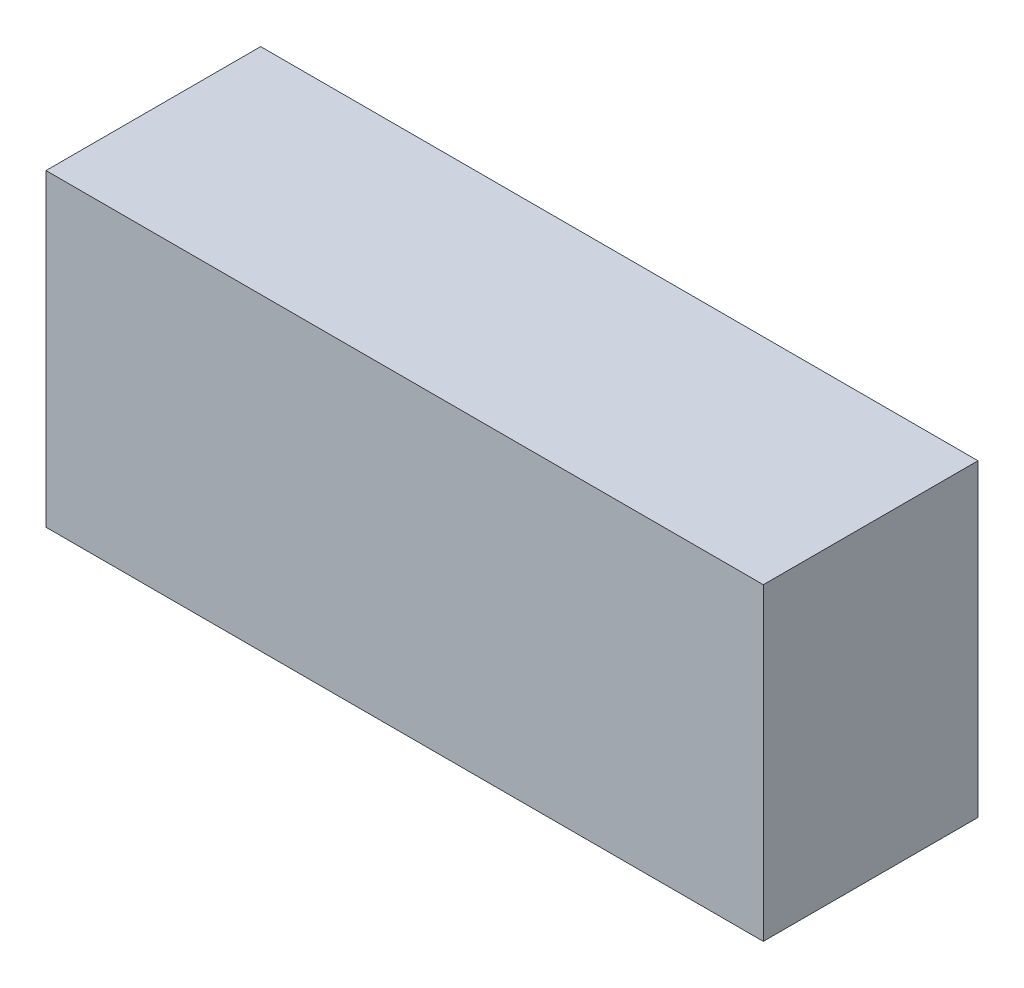
ISO-10303-21;
HEADER;
FILE_DESCRIPTION(('STEP AP214'),'2;1');
FILE_NAME('part.step','',(''),(''),'','','');
FILE_SCHEMA(('AUTOMOTIVE_DESIGN { 1 0 10303 214 1 1 1 1 }'));
ENDSEC;
DATA;
#1=APPLICATION_CONTEXT('core data for automotive mechanical design processes');
#2=APPLICATION_PROTOCOL_DEFINITION('international standard','automotive_design',2000,#1);
#3=PRODUCT_CONTEXT('',#1,'mechanical');
#4=PRODUCT('Part','Part','',(#3));
#5=PRODUCT_RELATED_PRODUCT_CATEGORY('part','',(#4));
#6=PRODUCT_DEFINITION_FORMATION('','',#4);
#7=PRODUCT_DEFINITION_CONTEXT('part definition',#1,'design');
#8=PRODUCT_DEFINITION('design','',#6,#7);
#9=PRODUCT_DEFINITION_SHAPE('','',#8);
#10=(LENGTH_UNIT() NAMED_UNIT(*) SI_UNIT(.MILLI.,.METRE.));
#11=(NAMED_UNIT(*) PLANE_ANGLE_UNIT() SI_UNIT($,.RADIAN.));
#12=(NAMED_UNIT(*) SI_UNIT($,.STERADIAN.) SOLID_ANGLE_UNIT());
#13=UNCERTAINTY_MEASURE_WITH_UNIT(LENGTH_MEASURE(1.E-05),#10,'distance_accuracy_value','');
#14=(GEOMETRIC_REPRESENTATION_CONTEXT(3) GLOBAL_UNCERTAINTY_ASSIGNED_CONTEXT((#13)) GLOBAL_UNIT_ASSIGNED_CONTEXT((#10,
#11,#12)) REPRESENTATION_CONTEXT('',''));
#15=CARTESIAN_POINT('',(0.,0.,0.));
#16=DIRECTION('',(0.,0.,1.));
#17=DIRECTION('',(1.,0.,0.));
#18=AXIS2_PLACEMENT_3D('',#15,#16,#17);
#19=CARTESIAN_POINT('',(68.5,59.,20.5));
#20=DIRECTION('',(-1.,0.,0.));
#21=DIRECTION('',(0.,0.,1.));
#22=AXIS2_PLACEMENT_3D('',#19,#20,#21);
#23=PLANE('',#22);
#24=DIRECTION('',(0.,0.,-1.));
#25=VECTOR('',#24,1.);
#26=CARTESIAN_POINT('',(68.5,0.,20.5));
#27=LINE('',#26,#25);
#28=CARTESIAN_POINT('',(68.5,0.,20.5));
#29=VERTEX_POINT('',#28);
#30=CARTESIAN_POINT('',(68.5,0.,-20.5));
#31=VERTEX_POINT('',#30);
#32=EDGE_CURVE('E99',#29,#31,#27,.T.);
#33=ORIENTED_EDGE('',*,*,#32,.T.);
#34=DIRECTION('',(0.,-1.,0.));
#35=VECTOR('',#34,1.);
#36=CARTESIAN_POINT('',(68.5,59.,-20.5));
#37=LINE('',#36,#35);
#38=CARTESIAN_POINT('',(68.5,59.,-20.5));
#39=VERTEX_POINT('',#38);
#40=EDGE_CURVE('E11',#39,#31,#37,.T.);
#41=ORIENTED_EDGE('',*,*,#40,.F.);
#42=DIRECTION('',(0.,0.,-1.));
#43=VECTOR('',#42,1.);
#44=CARTESIAN_POINT('',(68.5,59.,20.5));
#45=LINE('',#44,#43);
#46=CARTESIAN_POINT('',(68.5,59.,20.5));
#47=VERTEX_POINT('',#46);
#48=EDGE_CURVE('E87',#47,#39,#45,.T.);
#49=ORIENTED_EDGE('',*,*,#48,.F.);
#50=DIRECTION('',(0.,-1.,0.));
#51=VECTOR('',#50,1.);
#52=CARTESIAN_POINT('',(68.5,59.,20.5));
#53=LINE('',#52,#51);
#54=EDGE_CURVE('E95',#47,#29,#53,.T.);
#55=ORIENTED_EDGE('',*,*,#54,.T.);
#56=EDGE_LOOP('',(#33,#41,#49,#55));
#57=FACE_BOUND('',#56,.T.);
#58=ADVANCED_FACE('F36',(#57),#23,.F.);
#59=CARTESIAN_POINT('',(-68.5,59.,-20.5));
#60=DIRECTION('',(0.,0.,1.));
#61=DIRECTION('',(1.,0.,0.));
#62=AXIS2_PLACEMENT_3D('',#59,#60,#61);
#63=PLANE('',#62);
#64=DIRECTION('',(-1.,0.,0.));
#65=VECTOR('',#64,1.);
#66=CARTESIAN_POINT('',(-68.5,0.,-20.5));
#67=LINE('',#66,#65);
#68=CARTESIAN_POINT('',(-68.5,0.,-20.5));
#69=VERTEX_POINT('',#68);
#70=EDGE_CURVE('E91',#31,#69,#67,.T.);
#71=ORIENTED_EDGE('',*,*,#70,.T.);
#72=DIRECTION('',(0.,-1.,0.));
#73=VECTOR('',#72,1.);
#74=CARTESIAN_POINT('',(-68.5,59.,-20.5));
#75=LINE('',#74,#73);
#76=CARTESIAN_POINT('',(-68.5,59.,-20.5));
#77=VERTEX_POINT('',#76);
#78=EDGE_CURVE('E44',#77,#69,#75,.T.);
#79=ORIENTED_EDGE('',*,*,#78,.F.);
#80=DIRECTION('',(-1.,0.,0.));
#81=VECTOR('',#80,1.);
#82=CARTESIAN_POINT('',(-68.5,59.,-20.5));
#83=LINE('',#82,#81);
#84=EDGE_CURVE('E82',#39,#77,#83,.T.);
#85=ORIENTED_EDGE('',*,*,#84,.F.);
#86=ORIENTED_EDGE('',*,*,#40,.T.);
#87=EDGE_LOOP('',(#71,#79,#85,#86));
#88=FACE_BOUND('',#87,.T.);
#89=ADVANCED_FACE('F90',(#88),#63,.F.);
#90=CARTESIAN_POINT('',(-68.5,59.,20.5));
#91=DIRECTION('',(1.,0.,0.));
#92=DIRECTION('',(0.,0.,-1.));
#93=AXIS2_PLACEMENT_3D('',#90,#91,#92);
#94=PLANE('',#93);
#95=DIRECTION('',(0.,0.,1.));
#96=VECTOR('',#95,1.);
#97=CARTESIAN_POINT('',(-68.5,0.,20.5));
#98=LINE('',#97,#96);
#99=CARTESIAN_POINT('',(-68.5,0.,20.5));
#100=VERTEX_POINT('',#99);
#101=EDGE_CURVE('E69',#69,#100,#98,.T.);
#102=ORIENTED_EDGE('',*,*,#101,.T.);
#103=DIRECTION('',(0.,-1.,0.));
#104=VECTOR('',#103,1.);
#105=CARTESIAN_POINT('',(-68.5,59.,20.5));
#106=LINE('',#105,#104);
#107=CARTESIAN_POINT('',(-68.5,59.,20.5));
#108=VERTEX_POINT('',#107);
#109=EDGE_CURVE('E92',#108,#100,#106,.T.);
#110=ORIENTED_EDGE('',*,*,#109,.F.);
#111=DIRECTION('',(0.,0.,1.));
#112=VECTOR('',#111,1.);
#113=CARTESIAN_POINT('',(-68.5,59.,20.5));
#114=LINE('',#113,#112);
#115=EDGE_CURVE('E85',#77,#108,#114,.T.);
#116=ORIENTED_EDGE('',*,*,#115,.F.);
#117=ORIENTED_EDGE('',*,*,#78,.T.);
#118=EDGE_LOOP('',(#102,#110,#116,#117));
#119=FACE_BOUND('',#118,.T.);
#120=ADVANCED_FACE('F93',(#119),#94,.F.);
#121=CARTESIAN_POINT('',(-68.5,59.,20.5));
#122=DIRECTION('',(0.,0.,-1.));
#123=DIRECTION('',(-1.,0.,0.));
#124=AXIS2_PLACEMENT_3D('',#121,#122,#123);
#125=PLANE('',#124);
#126=DIRECTION('',(1.,0.,0.));
#127=VECTOR('',#126,1.);
#128=CARTESIAN_POINT('',(-68.5,0.,20.5));
#129=LINE('',#128,#127);
#130=EDGE_CURVE('E75',#100,#29,#129,.T.);
#131=ORIENTED_EDGE('',*,*,#130,.T.);
#132=ORIENTED_EDGE('',*,*,#54,.F.);
#133=DIRECTION('',(1.,0.,0.));
#134=VECTOR('',#133,1.);
#135=CARTESIAN_POINT('',(-68.5,59.,20.5));
#136=LINE('',#135,#134);
#137=EDGE_CURVE('E52',#108,#47,#136,.T.);
#138=ORIENTED_EDGE('',*,*,#137,.F.);
#139=ORIENTED_EDGE('',*,*,#109,.T.);
#140=EDGE_LOOP('',(#131,#132,#138,#139));
#141=FACE_BOUND('',#140,.T.);
#142=ADVANCED_FACE('F106',(#141),#125,.F.);
#143=CARTESIAN_POINT('',(0.,59.,0.));
#144=DIRECTION('',(0.,-1.,0.));
#145=DIRECTION('',(0.,0.,-1.));
#146=AXIS2_PLACEMENT_3D('',#143,#144,#145);
#147=PLANE('',#146);
#148=ORIENTED_EDGE('',*,*,#48,.T.);
#149=ORIENTED_EDGE('',*,*,#84,.T.);
#150=ORIENTED_EDGE('',*,*,#115,.T.);
#151=ORIENTED_EDGE('',*,*,#137,.T.);
#152=EDGE_LOOP('',(#148,#149,#150,#151));
#153=FACE_BOUND('',#152,.T.);
#154=ADVANCED_FACE('F83',(#153),#147,.F.);
#155=CARTESIAN_POINT('',(0.,0.,0.));
#156=DIRECTION('',(0.,-1.,0.));
#157=DIRECTION('',(0.,0.,-1.));
#158=AXIS2_PLACEMENT_3D('',#155,#156,#157);
#159=PLANE('',#158);
#160=ORIENTED_EDGE('',*,*,#32,.F.);
#161=ORIENTED_EDGE('',*,*,#130,.F.);
#162=ORIENTED_EDGE('',*,*,#101,.F.);
#163=ORIENTED_EDGE('',*,*,#70,.F.);
#164=EDGE_LOOP('',(#160,#161,#162,#163));
#165=FACE_BOUND('',#164,.T.);
#166=ADVANCED_FACE('F109',(#165),#159,.T.);
#167=CLOSED_SHELL('',(#58,#89,#120,#142,#154,#166));
#168=MANIFOLD_SOLID_BREP('B2',#167);
#169=ADVANCED_BREP_SHAPE_REPRESENTATION('',(#18,#168),#14);
#170=SHAPE_DEFINITION_REPRESENTATION(#9,#169);
ENDSEC;
END-ISO-10303-21;
